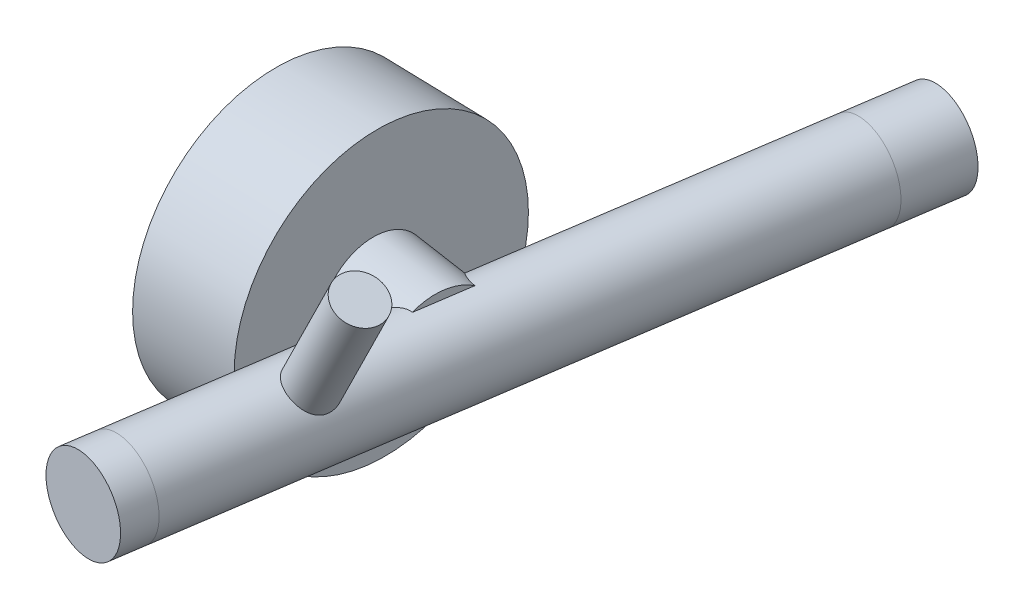
ISO-10303-21;
HEADER;
FILE_DESCRIPTION(('STEP AP214'),'2;1');
FILE_NAME('part.step','',(''),(''),'','','');
FILE_SCHEMA(('AUTOMOTIVE_DESIGN { 1 0 10303 214 1 1 1 1 }'));
ENDSEC;
DATA;
#1=APPLICATION_CONTEXT('core data for automotive mechanical design processes');
#2=APPLICATION_PROTOCOL_DEFINITION('international standard','automotive_design',2000,#1);
#3=PRODUCT_CONTEXT('',#1,'mechanical');
#4=PRODUCT('Part','Part','',(#3));
#5=PRODUCT_RELATED_PRODUCT_CATEGORY('part','',(#4));
#6=PRODUCT_DEFINITION_FORMATION('','',#4);
#7=PRODUCT_DEFINITION_CONTEXT('part definition',#1,'design');
#8=PRODUCT_DEFINITION('design','',#6,#7);
#9=PRODUCT_DEFINITION_SHAPE('','',#8);
#10=(LENGTH_UNIT() NAMED_UNIT(*) SI_UNIT(.MILLI.,.METRE.));
#11=(NAMED_UNIT(*) PLANE_ANGLE_UNIT() SI_UNIT($,.RADIAN.));
#12=(NAMED_UNIT(*) SI_UNIT($,.STERADIAN.) SOLID_ANGLE_UNIT());
#13=UNCERTAINTY_MEASURE_WITH_UNIT(LENGTH_MEASURE(1.E-05),#10,'distance_accuracy_value','');
#14=(GEOMETRIC_REPRESENTATION_CONTEXT(3) GLOBAL_UNCERTAINTY_ASSIGNED_CONTEXT((#13)) GLOBAL_UNIT_ASSIGNED_CONTEXT((#10,
#11,#12)) REPRESENTATION_CONTEXT('',''));
#15=CARTESIAN_POINT('',(0.,0.,0.));
#16=DIRECTION('',(0.,0.,1.));
#17=DIRECTION('',(1.,0.,0.));
#18=AXIS2_PLACEMENT_3D('',#15,#16,#17);
#19=CARTESIAN_POINT('',(-542.552954,1419.6,-162.373292));
#20=DIRECTION('',(-0.989015863441509,0.,-0.14780941059705));
#21=DIRECTION('',(-0.14780941059705,0.,0.989015863441509));
#22=AXIS2_PLACEMENT_3D('',#19,#20,#21);
#23=CYLINDRICAL_SURFACE('',#22,20.);
#24=CARTESIAN_POINT('',(-542.552954,1419.6,-162.373292));
#25=DIRECTION('',(-0.989015863441509,0.,-0.147809410597049));
#26=DIRECTION('',(-0.147809410597049,0.,0.989015863441509));
#27=AXIS2_PLACEMENT_3D('',#24,#25,#26);
#28=CIRCLE('',#27,20.);
#29=CARTESIAN_POINT('',(-544.110222763976,1436.6,-151.953363305583));
#30=VERTEX_POINT('',#29);
#31=CARTESIAN_POINT('',(-540.995685228536,1436.6,-172.793220693298));
#32=VERTEX_POINT('',#31);
#33=EDGE_CURVE('E115',#30,#32,#28,.T.);
#34=ORIENTED_EDGE('',*,*,#33,.T.);
#35=CARTESIAN_POINT('',(-540.995685236024,1436.6,-172.793220694417));
#36=CARTESIAN_POINT('',(-541.140799717402,1436.6000027427,-172.81489763645));
#37=CARTESIAN_POINT('',(-541.285433603555,1436.59809986526,-172.839624569867));
#38=CARTESIAN_POINT('',(-541.573434028901,1436.59051320884,-172.895031583175));
#39=CARTESIAN_POINT('',(-541.716800760971,1436.58483001569,-172.925710740151));
#40=CARTESIAN_POINT('',(-542.143956030332,1436.56218914441,-173.026314235167));
#41=CARTESIAN_POINT('',(-542.42546599188,1436.53963987295,-173.104905119131));
#42=CARTESIAN_POINT('',(-542.975876270462,1436.48068809962,-173.281539593919));
#43=CARTESIAN_POINT('',(-543.244904071715,1436.44450450193,-173.379264648698));
#44=CARTESIAN_POINT('',(-543.77394754055,1436.35905174085,-173.592140279418));
#45=CARTESIAN_POINT('',(-544.03395779421,1436.30977486523,-173.707301108175));
#46=CARTESIAN_POINT('',(-544.651192937682,1436.1758069705,-174.003258611011));
#47=CARTESIAN_POINT('',(-545.003572632827,1436.08492514702,-174.191356724659));
#48=CARTESIAN_POINT('',(-545.689353890084,1435.88075194828,-174.588663111797));
#49=CARTESIAN_POINT('',(-546.022747178634,1435.76745089836,-174.797880479816));
#50=CARTESIAN_POINT('',(-546.674552284306,1435.51907347671,-175.232704421948));
#51=CARTESIAN_POINT('',(-546.992813698709,1435.38382118947,-175.45843454881));
#52=CARTESIAN_POINT('',(-547.61278840835,1435.09341961031,-175.919413693505));
#53=CARTESIAN_POINT('',(-547.914502259248,1434.93827098707,-176.154662391247));
#54=CARTESIAN_POINT('',(-548.648105291446,1434.52742012704,-176.748058236567));
#55=CARTESIAN_POINT('',(-549.070717932135,1434.25989184851,-177.109537995157));
#56=CARTESIAN_POINT('',(-549.885414223956,1433.68312590637,-177.833886267784));
#57=CARTESIAN_POINT('',(-550.277483600929,1433.37386892343,-178.196755348981));
#58=CARTESIAN_POINT('',(-551.031346411772,1432.71471164914,-178.914528590849));
#59=CARTESIAN_POINT('',(-551.393208933736,1432.36490873265,-179.269449488214));
#60=CARTESIAN_POINT('',(-552.087275567161,1431.62403218624,-179.964694122371));
#61=CARTESIAN_POINT('',(-552.419491635391,1431.23297533466,-180.305023714975));
#62=CARTESIAN_POINT('',(-552.983262593467,1430.49970621035,-180.891812024833));
#63=CARTESIAN_POINT('',(-553.220926412971,1430.16555914915,-181.142502896956));
#64=CARTESIAN_POINT('',(-553.675844065069,1429.47213723682,-181.627224853981));
#65=CARTESIAN_POINT('',(-553.893098586732,1429.11286323475,-181.861256501274));
#66=CARTESIAN_POINT('',(-554.305190605022,1428.37010413023,-182.308774281713));
#67=CARTESIAN_POINT('',(-554.500052272652,1427.98664583854,-182.522282526453));
#68=CARTESIAN_POINT('',(-554.865480934127,1427.19621026646,-182.925250153307));
#69=CARTESIAN_POINT('',(-555.036052536744,1426.78923746834,-183.114714096816));
#70=CARTESIAN_POINT('',(-555.322437223528,1426.02818491063,-183.434401173977));
#71=CARTESIAN_POINT('',(-555.44258943374,1425.67763794469,-183.569161395526));
#72=CARTESIAN_POINT('',(-555.663524563173,1424.96329846946,-183.817770332757));
#73=CARTESIAN_POINT('',(-555.764311274815,1424.59950857021,-183.931623142626));
#74=CARTESIAN_POINT('',(-555.945164577548,1423.86063728769,-184.136428904689));
#75=CARTESIAN_POINT('',(-556.025239250538,1423.48556037262,-184.227390788613));
#76=CARTESIAN_POINT('',(-556.163522525511,1422.72629300462,-184.384747748264));
#77=CARTESIAN_POINT('',(-556.221730880333,1422.34210244873,-184.451142546305));
#78=CARTESIAN_POINT('',(-556.315538380175,1421.56555013415,-184.55825269903));
#79=CARTESIAN_POINT('',(-556.351030593499,1421.17315857943,-184.598846594995));
#80=CARTESIAN_POINT('',(-556.398341764731,1420.38508135375,-184.652976496145));
#81=CARTESIAN_POINT('',(-556.410160671915,1419.98939567573,-184.666512443352));
#82=CARTESIAN_POINT('',(-556.409908549607,1419.19806862012,-184.666223812691));
#83=CARTESIAN_POINT('',(-556.397839001597,1418.80242724129,-184.652400931528));
#84=CARTESIAN_POINT('',(-556.350033398823,1418.01447944453,-184.597706030679));
#85=CARTESIAN_POINT('',(-556.314298314347,1417.62217289053,-184.556835119964));
#86=CARTESIAN_POINT('',(-556.223310150456,1416.87289526612,-184.452947351115));
#87=CARTESIAN_POINT('',(-556.169701270584,1416.51546148257,-184.391797856046));
#88=CARTESIAN_POINT('',(-556.043519001952,1415.80834944679,-184.248176172043));
#89=CARTESIAN_POINT('',(-555.970946765983,1415.45867072453,-184.165705279249));
#90=CARTESIAN_POINT('',(-555.807781890001,1414.7689398642,-183.980799383681));
#91=CARTESIAN_POINT('',(-555.7171883563,1414.42888820449,-183.878363390828));
#92=CARTESIAN_POINT('',(-555.519040660957,1413.75996600363,-183.655083997582));
#93=CARTESIAN_POINT('',(-555.411485442213,1413.43109616091,-183.534239449928));
#94=CARTESIAN_POINT('',(-555.171373578034,1412.76021714197,-183.265580061784));
#95=CARTESIAN_POINT('',(-555.037511996609,1412.41922766413,-183.116387701423));
#96=CARTESIAN_POINT('',(-554.752684691415,1411.7528195225,-182.800661170998));
#97=CARTESIAN_POINT('',(-554.601718525511,1411.42740126151,-182.634126552664));
#98=CARTESIAN_POINT('',(-554.283863995787,1410.79271153222,-182.285756508253));
#99=CARTESIAN_POINT('',(-554.116967314961,1410.4834486301,-182.103913095668));
#100=CARTESIAN_POINT('',(-553.768426860045,1409.88167473533,-181.727065104611));
#101=CARTESIAN_POINT('',(-553.586780129569,1409.58916712111,-181.532057889017));
#102=CARTESIAN_POINT('',(-553.116190229106,1408.88031772024,-181.031408999705));
#103=CARTESIAN_POINT('',(-552.818700386523,1408.47448004356,-180.718849761276));
#104=CARTESIAN_POINT('',(-552.19519927087,1407.70105503824,-180.075201736628));
#105=CARTESIAN_POINT('',(-551.869174875182,1407.33348548048,-179.744104450521));
#106=CARTESIAN_POINT('',(-551.189253441463,1406.63590253596,-179.069171004765));
#107=CARTESIAN_POINT('',(-550.835301802184,1406.30596596696,-178.725310622999));
#108=CARTESIAN_POINT('',(-550.100217217311,1405.68448672124,-178.032279246668));
#109=CARTESIAN_POINT('',(-549.719093091591,1405.392931673,-177.68311000399));
#110=CARTESIAN_POINT('',(-549.018761665479,1404.91077601618,-177.066822432202));
#111=CARTESIAN_POINT('',(-548.705349405213,1404.71234265538,-176.799216562056));
#112=CARTESIAN_POINT('',(-548.060138787278,1404.33885448666,-176.269683214557));
#113=CARTESIAN_POINT('',(-547.728338057418,1404.16380270505,-176.007756475929));
#114=CARTESIAN_POINT('',(-547.045414130574,1403.83839982907,-175.495652144994));
#115=CARTESIAN_POINT('',(-546.694335290016,1403.68799496292,-175.245449849424));
#116=CARTESIAN_POINT('',(-545.97022542962,1403.41302481959,-174.763313662659));
#117=CARTESIAN_POINT('',(-545.597208067733,1403.28844367979,-174.53136861131));
#118=CARTESIAN_POINT('',(-544.965401203133,1403.10704028345,-174.173096314311));
#119=CARTESIAN_POINT('',(-544.713556547671,1403.04193151869,-174.038697173453));
#120=CARTESIAN_POINT('',(-544.200011174257,1402.9241295149,-173.784115569016));
#121=CARTESIAN_POINT('',(-543.938314352556,1402.8714314264,-173.663927561609));
#122=CARTESIAN_POINT('',(-543.406216588738,1402.77946313135,-173.44118097017));
#123=CARTESIAN_POINT('',(-543.135847028226,1402.74014942738,-173.338565827751));
#124=CARTESIAN_POINT('',(-542.586748598962,1402.67559058367,-173.153529261868));
#125=CARTESIAN_POINT('',(-542.308025528213,1402.6503359137,-173.071094180197));
#126=CARTESIAN_POINT('',(-541.856442299357,1402.6216642039,-172.957145065278));
#127=CARTESIAN_POINT('',(-541.685661893732,1402.61355530409,-172.918430413791));
#128=CARTESIAN_POINT('',(-541.342046895883,1402.60271647828,-172.849417142083));
#129=CARTESIAN_POINT('',(-541.169210257104,1402.59999245838,-172.81912779391));
#130=CARTESIAN_POINT('',(-540.995685236024,1402.6,-172.793220694417));
#131=B_SPLINE_CURVE_WITH_KNOTS('',3,(#35,#36,#37,#38,#39,#40,#41,#42,#43,#44,#45,#46,#47,#48,
#49,#50,#51,#52,#53,#54,#55,#56,#57,#58,#59,#60,#61,#62,#63,#64,#65,#66,#67,#68,#69,#70,#71,#72,
#73,#74,#75,#76,#77,#78,#79,#80,#81,#82,#83,#84,#85,#86,#87,#88,#89,#90,#91,#92,#93,#94,#95,#96,
#97,#98,#99,#100,#101,#102,#103,#104,#105,#106,#107,#108,#109,#110,#111,#112,#113,#114,#115,
#116,#117,#118,#119,#120,#121,#122,#123,#124,#125,#126,#127,#128,#129,#130),.UNSPECIFIED.,.F.,
.F.,(4,2,2,2,2,2,2,2,2,2,2,2,2,2,2,2,2,2,2,2,2,2,2,2,2,2,2,2,2,2,2,2,2,2,2,2,2,2,2,2,2,2,2,2,2,
2,2,4),(0.,0.440081980607926,0.880095779401678,1.75811038662614,2.62259049388785,
3.48758093288357,4.71450333374393,5.94195635339323,7.17978159933149,8.41756525412041,
10.2664756149553,12.1162449298221,13.9616604664429,15.8063283289607,17.2469130549875,
18.6874491258524,20.1264153691471,21.56510821968,22.7468833824736,23.9284268771906,
25.1095086322015,26.2906037367943,27.4772184950212,28.6638357958308,29.8503795088296,
31.0368745764645,32.1353690064708,33.2337966740178,34.3322788269713,35.4308294677123,
36.6163134073204,37.8018279974562,38.9879649423625,40.1743402169242,41.9489029453851,
43.7242861007542,45.5032307190019,47.2816005184909,48.6529216495624,50.0244201005837,
51.3928853481091,52.7605074871563,53.638243458844,54.5156358840483,55.3901490601416,
56.2640687042674,56.7896992629492,57.3159060098977),.UNSPECIFIED.);
#132=CARTESIAN_POINT('',(-540.995685228536,1402.6,-172.793220693298));
#133=VERTEX_POINT('',#132);
#134=EDGE_CURVE('E88',#32,#133,#131,.T.);
#135=ORIENTED_EDGE('',*,*,#134,.T.);
#136=CARTESIAN_POINT('',(-544.110222763976,1402.6,-151.953363305583));
#137=VERTEX_POINT('',#136);
#138=EDGE_CURVE('E117',#133,#137,#28,.T.);
#139=ORIENTED_EDGE('',*,*,#138,.T.);
#140=CARTESIAN_POINT('',(-544.110222763976,1402.6,-151.953363305583));
#141=CARTESIAN_POINT('',(-544.255334157068,1402.5999972573,-151.975060910947));
#142=CARTESIAN_POINT('',(-544.400877685838,1402.60190013474,-151.993701282605));
#143=CARTESIAN_POINT('',(-544.692493305027,1402.60948679114,-152.024918467252));
#144=CARTESIAN_POINT('',(-544.838565310062,1402.61516998428,-152.037496219221));
#145=CARTESIAN_POINT('',(-545.276469540674,1402.63781085553,-152.066176732284));
#146=CARTESIAN_POINT('',(-545.568656606228,1402.66036012695,-152.07332544323));
#147=CARTESIAN_POINT('',(-546.146659495367,1402.7193119002,-152.065333445798));
#148=CARTESIAN_POINT('',(-546.432504101793,1402.75549549785,-152.050534627734));
#149=CARTESIAN_POINT('',(-547.000669697661,1402.84094825882,-152.001637989972));
#150=CARTESIAN_POINT('',(-547.282988507379,1402.89022513439,-151.967528782581));
#151=CARTESIAN_POINT('',(-547.959783009248,1403.02419302891,-151.8649653056));
#152=CARTESIAN_POINT('',(-548.351759953029,1403.11507485222,-151.788112036831));
#153=CARTESIAN_POINT('',(-549.123736975125,1403.31924805057,-151.608669083974));
#154=CARTESIAN_POINT('',(-549.503731800376,1403.43254910028,-151.506068283788));
#155=CARTESIAN_POINT('',(-550.25418633861,1403.68092652146,-151.280813449367));
#156=CARTESIAN_POINT('',(-550.624538344085,1403.81617880843,-151.157997287551));
#157=CARTESIAN_POINT('',(-551.352200364359,1404.10658038704,-150.898423801418));
#158=CARTESIAN_POINT('',(-551.709510816953,1404.26172900998,-150.761666945665));
#159=CARTESIAN_POINT('',(-552.584551038931,1404.67257986935,-150.408684445139));
#160=CARTESIAN_POINT('',(-553.094383969562,1404.94010814751,-150.186559610606));
#161=CARTESIAN_POINT('',(-554.08526084572,1405.51687408888,-149.732056055383));
#162=CARTESIAN_POINT('',(-554.566291306622,1405.82613107141,-149.499672618955));
#163=CARTESIAN_POINT('',(-555.497070482698,1406.48528834481,-149.033670808377));
#164=CARTESIAN_POINT('',(-555.946890160481,1406.83509126082,-148.800056628253));
#165=CARTESIAN_POINT('',(-556.813899240366,1407.57596780621,-148.338116322045));
#166=CARTESIAN_POINT('',(-557.231101788859,1407.96702465724,-148.109788091841));
#167=CARTESIAN_POINT('',(-557.941798935157,1408.70029378106,-147.713470315435));
#168=CARTESIAN_POINT('',(-558.242372893724,1409.03444084238,-147.543219617593));
#169=CARTESIAN_POINT('',(-558.819131792904,1409.72786275499,-147.21268275303));
#170=CARTESIAN_POINT('',(-559.095317556904,1410.08713675721,-147.052396249955));
#171=CARTESIAN_POINT('',(-559.620244650246,1410.82989586207,-146.74491691292));
#172=CARTESIAN_POINT('',(-559.869015559237,1411.21335415395,-146.597710000453));
#173=CARTESIAN_POINT('',(-560.336293058173,1412.00378972643,-146.31919114209));
#174=CARTESIAN_POINT('',(-560.55480538913,1412.41076252475,-146.187876181583));
#175=CARTESIAN_POINT('',(-560.922143882865,1413.17181508288,-145.965888687535));
#176=CARTESIAN_POINT('',(-561.076446088637,1413.52236204902,-145.872145952931));
#177=CARTESIAN_POINT('',(-561.360413622474,1414.23670152467,-145.698995223656));
#178=CARTESIAN_POINT('',(-561.490083774275,1414.60049142414,-145.619584422493));
#179=CARTESIAN_POINT('',(-561.722914057632,1415.3393627071,-145.476604086059));
#180=CARTESIAN_POINT('',(-561.826084529332,1415.71443962239,-145.413028372249));
#181=CARTESIAN_POINT('',(-562.004332205452,1416.47370699086,-145.302977279747));
#182=CARTESIAN_POINT('',(-562.079409092326,1416.85789754699,-145.256502094345));
#183=CARTESIAN_POINT('',(-562.200433628591,1417.63444986206,-145.181498804199));
#184=CARTESIAN_POINT('',(-562.246243507601,1418.02684141703,-145.153055587205));
#185=CARTESIAN_POINT('',(-562.30731345724,1418.81491864321,-145.115123352875));
#186=CARTESIAN_POINT('',(-562.322573462409,1419.21060432149,-145.105634376154));
#187=CARTESIAN_POINT('',(-562.322247969338,1420.00193137763,-145.105836681518));
#188=CARTESIAN_POINT('',(-562.306664383917,1420.39757275672,-145.11552677418));
#189=CARTESIAN_POINT('',(-562.244956417377,1421.18552055402,-145.153854762458));
#190=CARTESIAN_POINT('',(-562.198833288382,1421.57782710829,-145.182491881243));
#191=CARTESIAN_POINT('',(-562.081447030605,1422.32710473324,-145.255237884263));
#192=CARTESIAN_POINT('',(-562.012302221787,1422.68453851706,-145.298041717735));
#193=CARTESIAN_POINT('',(-561.849642601755,1423.39165055337,-145.398495692495));
#194=CARTESIAN_POINT('',(-561.756129271916,1423.74132927589,-145.45614493132));
#195=CARTESIAN_POINT('',(-561.546032673278,1424.43106013675,-145.585266526096));
#196=CARTESIAN_POINT('',(-561.429448260369,1424.77111179672,-145.656739567573));
#197=CARTESIAN_POINT('',(-561.174678100264,1425.4400339981,-145.812329934249));
#198=CARTESIAN_POINT('',(-561.036491006729,1425.76890384107,-145.89644804751));
#199=CARTESIAN_POINT('',(-560.72832248595,1426.43978286046,-146.083166383648));
#200=CARTESIAN_POINT('',(-560.556690394383,1426.78077233849,-146.18670240897));
#201=CARTESIAN_POINT('',(-560.191999184115,1427.4471804805,-146.405357747496));
#202=CARTESIAN_POINT('',(-559.998939511535,1427.77259874168,-146.520477360117));
#203=CARTESIAN_POINT('',(-559.593120169536,1428.40728847133,-146.760693620464));
#204=CARTESIAN_POINT('',(-559.380350211495,1428.71655137362,-146.885795474069));
#205=CARTESIAN_POINT('',(-558.936859627473,1429.31832526872,-147.144273634045));
#206=CARTESIAN_POINT('',(-558.706135403268,1429.61083288311,-147.277651597946));
#207=CARTESIAN_POINT('',(-558.109732474714,1430.31968228395,-147.618837341348));
#208=CARTESIAN_POINT('',(-557.733858046556,1430.72551996046,-147.830761615648));
#209=CARTESIAN_POINT('',(-556.949416495168,1431.49894496549,-148.263991199703));
#210=CARTESIAN_POINT('',(-556.540834337588,1431.86651452311,-148.485300801259));
#211=CARTESIAN_POINT('',(-555.693290795832,1432.56409746737,-148.931953077792));
#212=CARTESIAN_POINT('',(-555.25427011436,1432.89403403625,-149.157302952634));
#213=CARTESIAN_POINT('',(-554.348682465983,1433.51551328173,-149.605134221745));
#214=CARTESIAN_POINT('',(-553.882124445767,1433.80706832985,-149.827616519359));
#215=CARTESIAN_POINT('',(-553.032209125721,1434.28922398617,-150.212218163117));
#216=CARTESIAN_POINT('',(-552.65425110715,1434.48765734661,-150.376498052843));
#217=CARTESIAN_POINT('',(-551.882412559016,1434.86114551468,-150.694251983649));
#218=CARTESIAN_POINT('',(-551.488529976898,1435.036197296,-150.847724624723));
#219=CARTESIAN_POINT('',(-550.685721763402,1435.36160017145,-151.137784799758));
#220=CARTESIAN_POINT('',(-550.276831327748,1435.51200503737,-151.274408926131));
#221=CARTESIAN_POINT('',(-549.443398647524,1435.78697518031,-151.523768820885));
#222=CARTESIAN_POINT('',(-549.018866201203,1435.91155631994,-151.636519254971));
#223=CARTESIAN_POINT('',(-548.309917610756,1436.09295971616,-151.794414307194));
#224=CARTESIAN_POINT('',(-548.02978286332,1436.15806848094,-151.849308593889));
#225=CARTESIAN_POINT('',(-547.464244523164,1436.27587048474,-151.942620057405));
#226=CARTESIAN_POINT('',(-547.178843035589,1436.32856857325,-151.981043674969));
#227=CARTESIAN_POINT('',(-546.604870613224,1436.42053686834,-152.03848697017));
#228=CARTESIAN_POINT('',(-546.316313152741,1436.45985057233,-152.057569909956));
#229=CARTESIAN_POINT('',(-545.737108257555,1436.52440941609,-152.07398041487));
#230=CARTESIAN_POINT('',(-545.446462374236,1436.54966408608,-152.071322736579));
#231=CARTESIAN_POINT('',(-544.981295687498,1436.57833579599,-152.048262659284));
#232=CARTESIAN_POINT('',(-544.80665850425,1436.58644469584,-152.035354306491));
#233=CARTESIAN_POINT('',(-544.457880318742,1436.59728352171,-152.000888724093));
#234=CARTESIAN_POINT('',(-544.283740070236,1436.60000754162,-151.979322029231));
#235=CARTESIAN_POINT('',(-544.110222763976,1436.6,-151.953363305583));
#236=B_SPLINE_CURVE_WITH_KNOTS('',3,(#140,#141,#142,#143,#144,#145,#146,#147,#148,#149,#150,
#151,#152,#153,#154,#155,#156,#157,#158,#159,#160,#161,#162,#163,#164,#165,#166,#167,#168,#169,
#170,#171,#172,#173,#174,#175,#176,#177,#178,#179,#180,#181,#182,#183,#184,#185,#186,#187,#188,
#189,#190,#191,#192,#193,#194,#195,#196,#197,#198,#199,#200,#201,#202,#203,#204,#205,#206,#207,
#208,#209,#210,#211,#212,#213,#214,#215,#216,#217,#218,#219,#220,#221,#222,#223,#224,#225,#226,
#227,#228,#229,#230,#231,#232,#233,#234,#235),.UNSPECIFIED.,.F.,.F.,(4,2,2,2,2,2,2,2,2,2,2,2,2,
2,2,2,2,2,2,2,2,2,2,2,2,2,2,2,2,2,2,2,2,2,2,2,2,2,2,2,2,2,2,2,2,2,2,4),(0.,0.440081980221863,
0.880095778630183,1.75811038509224,2.62259049160744,3.48758092985339,4.71450332865346,
5.94195634624074,7.17978159008018,8.41756524277089,10.2664756015107,12.1162449142823,
13.9616604488472,15.8063283093133,17.2469130362691,18.6874491080636,20.1264153522833,
21.5651082037415,22.7468833673204,23.9284268628228,25.1095086186199,26.2906037239995,
27.4772184830117,28.6638357846067,29.8503794983903,31.03687456681,32.1353689975889,
33.2337966659083,34.3322788196332,35.4308294611452,36.6163134013437,37.8018279920691,
38.9879649375685,40.1743402127226,41.9489029403789,43.7242860949417,45.5032307123635,
47.2816005110255,48.6529216395019,50.0244200879254,51.3928853328607,52.7605074693228,
53.6382434404235,54.5156358650412,55.3901490405579,56.2640686841088,56.7896992441561,
57.3159059924721),.UNSPECIFIED.);
#237=EDGE_CURVE('E107',#137,#30,#236,.T.);
#238=ORIENTED_EDGE('',*,*,#237,.T.);
#239=EDGE_LOOP('',(#34,#135,#139,#238));
#240=FACE_BOUND('',#239,.T.);
#241=CARTESIAN_POINT('',(-573.655585503097,1419.6,-167.021611405609));
#242=DIRECTION('',(-0.999657324931295,0.,-0.0261769499982011));
#243=DIRECTION('',(0.0261769499982011,0.,-0.999657324931295));
#244=AXIS2_PLACEMENT_3D('',#241,#242,#243);
#245=ELLIPSE('',#244,20.1501965036612,20.);
#246=CARTESIAN_POINT('',(-573.128114816766,1419.6,-187.164902939298));
#247=VERTEX_POINT('',#246);
#248=EDGE_CURVE('E83',#247,#247,#245,.F.);
#249=ORIENTED_EDGE('',*,*,#248,.T.);
#250=EDGE_LOOP('',(#249));
#251=FACE_BOUND('',#250,.T.);
#252=ADVANCED_FACE('F79',(#240,#251),#23,.T.);
#253=CARTESIAN_POINT('',(-517.770606,1419.6,-328.195852));
#254=DIRECTION('',(0.147809419708946,0.,-0.989015862079727));
#255=DIRECTION('',(-0.989015862079727,0.,-0.147809419708946));
#256=AXIS2_PLACEMENT_3D('',#253,#254,#255);
#257=PLANE('',#256);
#258=CARTESIAN_POINT('',(-517.770606,1419.6,-328.195852));
#259=DIRECTION('',(0.147809419708946,0.,-0.989015862079727));
#260=DIRECTION('',(-0.989015862079727,0.,-0.147809419708946));
#261=AXIS2_PLACEMENT_3D('',#258,#259,#260);
#262=CIRCLE('',#261,17.);
#263=CARTESIAN_POINT('',(-534.583875655355,1419.6,-330.708612135052));
#264=VERTEX_POINT('',#263);
#265=EDGE_CURVE('E118',#264,#264,#262,.T.);
#266=ORIENTED_EDGE('',*,*,#265,.T.);
#267=EDGE_LOOP('',(#266));
#268=FACE_BOUND('',#267,.T.);
#269=ADVANCED_FACE('F81',(#268),#257,.T.);
#270=CARTESIAN_POINT('',(-521.613651,1419.6,-302.481439));
#271=DIRECTION('',(0.147809419708946,0.,-0.989015862079727));
#272=DIRECTION('',(-0.989015862079727,0.,-0.147809419708946));
#273=AXIS2_PLACEMENT_3D('',#270,#271,#272);
#274=CYLINDRICAL_SURFACE('',#273,17.);
#275=ORIENTED_EDGE('',*,*,#265,.F.);
#276=EDGE_LOOP('',(#275));
#277=FACE_BOUND('',#276,.T.);
#278=CARTESIAN_POINT('',(-521.613651434475,1419.6,-302.481439064933));
#279=DIRECTION('',(0.147809419708946,0.,-0.989015862079727));
#280=DIRECTION('',(-0.989015862079727,0.,-0.147809419708946));
#281=AXIS2_PLACEMENT_3D('',#278,#279,#280);
#282=CIRCLE('',#281,17.0000000000001);
#283=CARTESIAN_POINT('',(-538.426921089831,1419.6,-304.994199199985));
#284=VERTEX_POINT('',#283);
#285=EDGE_CURVE('E132',#284,#284,#282,.T.);
#286=ORIENTED_EDGE('',*,*,#285,.T.);
#287=EDGE_LOOP('',(#286));
#288=FACE_BOUND('',#287,.T.);
#289=ADVANCED_FACE('F153',(#277,#288),#274,.T.);
#290=CARTESIAN_POINT('',(-558.6,1419.6,-55.));
#291=DIRECTION('',(0.147809409886339,0.,-0.989015863547725));
#292=DIRECTION('',(-0.989015863547725,0.,-0.147809409886339));
#293=AXIS2_PLACEMENT_3D('',#290,#291,#292);
#294=CYLINDRICAL_SURFACE('',#293,17.0000000000001);
#295=CARTESIAN_POINT('',(-551.093058189755,1436.57165335643,-111.869188396827));
#296=CARTESIAN_POINT('',(-551.091903565267,1436.57381364335,-111.62423998645));
#297=CARTESIAN_POINT('',(-551.079181504332,1436.57652013393,-111.379321171468));
#298=CARTESIAN_POINT('',(-551.031343575187,1436.58239430512,-110.891588432794));
#299=CARTESIAN_POINT('',(-550.996214561069,1436.58556225561,-110.648775829612));
#300=CARTESIAN_POINT('',(-550.904566853397,1436.591510953,-110.166681244256));
#301=CARTESIAN_POINT('',(-550.848002130336,1436.59429084892,-109.927408019298));
#302=CARTESIAN_POINT('',(-550.714818525198,1436.59845609358,-109.4544548886));
#303=CARTESIAN_POINT('',(-550.638190344272,1436.59984079425,-109.220777631389));
#304=CARTESIAN_POINT('',(-550.381544769377,1436.60027759939,-108.53352971869));
#305=CARTESIAN_POINT('',(-550.174015282011,1436.59569078573,-108.089980964553));
#306=CARTESIAN_POINT('',(-549.696279310266,1436.56800727711,-107.239015407316));
#307=CARTESIAN_POINT('',(-549.426082522395,1436.54491344439,-106.831593027851));
#308=CARTESIAN_POINT('',(-548.966978041143,1436.48840449762,-106.23434869844));
#309=CARTESIAN_POINT('',(-548.796390468757,1436.46434604014,-106.02928049249));
#310=CARTESIAN_POINT('',(-548.440783233712,1436.40687615461,-105.633319821777));
#311=CARTESIAN_POINT('',(-548.255761159289,1436.37346316115,-105.442429736386));
#312=CARTESIAN_POINT('',(-547.872848762992,1436.2960991065,-105.076192522064));
#313=CARTESIAN_POINT('',(-547.674954066601,1436.25214444914,-104.900850725265));
#314=CARTESIAN_POINT('',(-547.268086658243,1436.15269818624,-104.567286936142));
#315=CARTESIAN_POINT('',(-547.059119357271,1436.09721217784,-104.409056694579));
#316=CARTESIAN_POINT('',(-546.633171723543,1435.97425724878,-104.112081844544));
#317=CARTESIAN_POINT('',(-546.416251037618,1435.90686705877,-103.973219329288));
#318=CARTESIAN_POINT('',(-545.975075393924,1435.75931209358,-103.715287488097));
#319=CARTESIAN_POINT('',(-545.750820361147,1435.67914718773,-103.59621836466));
#320=CARTESIAN_POINT('',(-545.297295666776,1435.50588882078,-103.379403918994));
#321=CARTESIAN_POINT('',(-545.068030397971,1435.41280633018,-103.281640681557));
#322=CARTESIAN_POINT('',(-544.606605882323,1435.21381948786,-103.108589574378));
#323=CARTESIAN_POINT('',(-544.374447014359,1435.10791679928,-103.033298793704));
#324=CARTESIAN_POINT('',(-543.935345659552,1434.8962674459,-102.913211071024));
#325=CARTESIAN_POINT('',(-543.728453821259,1434.7917987238,-102.865962637669));
#326=CARTESIAN_POINT('',(-543.315955089675,1434.57386247416,-102.790481339391));
#327=CARTESIAN_POINT('',(-543.110348092234,1434.46039568647,-102.762246912849));
#328=CARTESIAN_POINT('',(-542.702073626771,1434.22540417849,-102.725004493409));
#329=CARTESIAN_POINT('',(-542.499405647921,1434.10388087944,-102.715993118613));
#330=CARTESIAN_POINT('',(-542.098464456958,1433.85388307722,-102.717134402881));
#331=CARTESIAN_POINT('',(-541.900191229101,1433.72540859895,-102.727286993284));
#332=CARTESIAN_POINT('',(-541.518970553319,1433.46925264989,-102.765496074121));
#333=CARTESIAN_POINT('',(-541.335748786302,1433.34184247587,-102.792648198727));
#334=CARTESIAN_POINT('',(-540.975354848192,1433.08304180055,-102.86359750666));
#335=CARTESIAN_POINT('',(-540.798184774396,1432.95164994853,-102.907400398016));
#336=CARTESIAN_POINT('',(-540.450772515199,1432.68619961413,-103.011087548394));
#337=CARTESIAN_POINT('',(-540.28052856395,1432.5521418246,-103.070967678486));
#338=CARTESIAN_POINT('',(-539.947438670942,1432.28253009162,-103.206206923746));
#339=CARTESIAN_POINT('',(-539.784595636409,1432.14697558579,-103.281572058636));
#340=CARTESIAN_POINT('',(-539.456051587786,1431.86650524521,-103.452688791489));
#341=CARTESIAN_POINT('',(-539.290900510969,1431.72157556048,-103.549473572075));
#342=CARTESIAN_POINT('',(-538.969860447167,1431.43296954137,-103.759103940655));
#343=CARTESIAN_POINT('',(-538.813974666274,1431.28929365534,-103.871955042779));
#344=CARTESIAN_POINT('',(-538.511641626941,1431.00469591358,-104.112934625357));
#345=CARTESIAN_POINT('',(-538.365198275699,1430.86377521451,-104.241069368341));
#346=CARTESIAN_POINT('',(-538.081890999047,1430.58626474881,-104.511811382801));
#347=CARTESIAN_POINT('',(-537.945027730484,1430.44967527949,-104.654419644994));
#348=CARTESIAN_POINT('',(-537.666519495855,1430.16783007756,-104.969649447326));
#349=CARTESIAN_POINT('',(-537.525973991433,1430.02324798793,-105.143848331633));
#350=CARTESIAN_POINT('',(-537.256695238076,1429.74354210634,-105.50812189446));
#351=CARTESIAN_POINT('',(-537.127958417376,1429.60841545736,-105.698191739052));
#352=CARTESIAN_POINT('',(-536.882156002692,1429.34977723098,-106.093395568098));
#353=CARTESIAN_POINT('',(-536.765096302014,1429.22627152028,-106.298537069257));
#354=CARTESIAN_POINT('',(-536.542736507188,1428.99332297331,-106.722773619164));
#355=CARTESIAN_POINT('',(-536.437437783447,1428.88388177563,-106.941870289327));
#356=CARTESIAN_POINT('',(-536.238111667931,1428.68090217842,-107.394160997876));
#357=CARTESIAN_POINT('',(-536.144158313038,1428.58746672991,-107.627434114613));
#358=CARTESIAN_POINT('',(-535.968566985357,1428.41984969986,-108.105133335521));
#359=CARTESIAN_POINT('',(-535.886922006273,1428.34565714723,-108.349552990746));
#360=CARTESIAN_POINT('',(-535.736319836531,1428.21879008934,-108.847383017228));
#361=CARTESIAN_POINT('',(-535.667346685507,1428.16608841248,-109.10078159256));
#362=CARTESIAN_POINT('',(-535.542395880834,1428.08387458026,-109.614442798663));
#363=CARTESIAN_POINT('',(-535.486415708089,1428.05435792711,-109.874704087967));
#364=CARTESIAN_POINT('',(-535.394762476408,1428.02199563926,-110.362821132742));
#365=CARTESIAN_POINT('',(-535.357347743538,1428.01601077182,-110.590147871438));
#366=CARTESIAN_POINT('',(-535.292769029166,1428.02216740745,-111.045994846708));
#367=CARTESIAN_POINT('',(-535.26560401531,1428.03430708439,-111.274514960733));
#368=CARTESIAN_POINT('',(-535.221777252474,1428.0763755876,-111.73094363378));
#369=CARTESIAN_POINT('',(-535.205116972,1428.10630689991,-111.958852102865));
#370=CARTESIAN_POINT('',(-535.182523122953,1428.18315392843,-112.412314086409));
#371=CARTESIAN_POINT('',(-535.176589723206,1428.23006991194,-112.637867563749));
#372=CARTESIAN_POINT('',(-535.175660554863,1428.3366872048,-113.072754118915));
#373=CARTESIAN_POINT('',(-535.180079102985,1428.39553979995,-113.28229528781));
#374=CARTESIAN_POINT('',(-535.19878881583,1428.52617233692,-113.696888822209));
#375=CARTESIAN_POINT('',(-535.213083278172,1428.59795659077,-113.901939664768));
#376=CARTESIAN_POINT('',(-535.270977355308,1428.83074276938,-114.50885680672));
#377=CARTESIAN_POINT('',(-535.329586772506,1429.00924378069,-114.902745536031));
#378=CARTESIAN_POINT('',(-535.497657704577,1429.42609467783,-115.709698868348));
#379=CARTESIAN_POINT('',(-535.61244531615,1429.66908685453,-116.119251887707));
#380=CARTESIAN_POINT('',(-535.824738012698,1430.05653443848,-116.703377502538));
#381=CARTESIAN_POINT('',(-535.902254375237,1430.18960929075,-116.893171766986));
#382=CARTESIAN_POINT('',(-536.070974217584,1430.46186023957,-117.262118121408));
#383=CARTESIAN_POINT('',(-536.162179814965,1430.60103727769,-117.441268558905));
#384=CARTESIAN_POINT('',(-536.369468941284,1430.89965115576,-117.807532078429));
#385=CARTESIAN_POINT('',(-536.487194494049,1431.05961179944,-117.99329131333));
#386=CARTESIAN_POINT('',(-536.739977394625,1431.38274224282,-118.349464572111));
#387=CARTESIAN_POINT('',(-536.875028284896,1431.54591082777,-118.519884273309));
#388=CARTESIAN_POINT('',(-537.162551519991,1431.87332552039,-118.844235337875));
#389=CARTESIAN_POINT('',(-537.315024126801,1432.03757164424,-118.998166453221));
#390=CARTESIAN_POINT('',(-537.637189731345,1432.36491922336,-119.288205335385));
#391=CARTESIAN_POINT('',(-537.806881277795,1432.52802077385,-119.424314602092));
#392=CARTESIAN_POINT('',(-538.155365507962,1432.84397603024,-119.671949191868));
#393=CARTESIAN_POINT('',(-538.333461010702,1432.99697006769,-119.784275623972));
#394=CARTESIAN_POINT('',(-538.704157322455,1433.29795917263,-119.990173558281));
#395=CARTESIAN_POINT('',(-538.896757885892,1433.44595432469,-120.083745377908));
#396=CARTESIAN_POINT('',(-539.295118540528,1433.73497912537,-120.250996025148));
#397=CARTESIAN_POINT('',(-539.500868286425,1433.87601409887,-120.324690259096));
#398=CARTESIAN_POINT('',(-539.924077949446,1434.14953373181,-120.451397012073));
#399=CARTESIAN_POINT('',(-540.141536594135,1434.28201931689,-120.504411773252));
#400=CARTESIAN_POINT('',(-540.561776003491,1434.52296070345,-120.584500131429));
#401=CARTESIAN_POINT('',(-540.763543198946,1434.6324571851,-120.613784436068));
#402=CARTESIAN_POINT('',(-541.173280812297,1434.84269950327,-120.655280441683));
#403=CARTESIAN_POINT('',(-541.381250698829,1434.9434460865,-120.667493600826));
#404=CARTESIAN_POINT('',(-541.801738493761,1435.1355881772,-120.6748369204));
#405=CARTESIAN_POINT('',(-542.014256167479,1435.2269841658,-120.66996796023));
#406=CARTESIAN_POINT('',(-542.44215851007,1435.40007697071,-120.643331997232));
#407=CARTESIAN_POINT('',(-542.657543231706,1435.48177360824,-120.621564682989));
#408=CARTESIAN_POINT('',(-543.084685891677,1435.63364008804,-120.562147880519));
#409=CARTESIAN_POINT('',(-543.296418109367,1435.70402567487,-120.524861945562));
#410=CARTESIAN_POINT('',(-543.719560727538,1435.83552830299,-120.434892208601));
#411=CARTESIAN_POINT('',(-543.930970990029,1435.89664210325,-120.382203041035));
#412=CARTESIAN_POINT('',(-544.351914545733,1436.00983387722,-120.261956055752));
#413=CARTESIAN_POINT('',(-544.561448197933,1436.06191361569,-120.19440114786));
#414=CARTESIAN_POINT('',(-544.977399708513,1436.15749175767,-120.044943750158));
#415=CARTESIAN_POINT('',(-545.183816408637,1436.2009870403,-119.963036062772));
#416=CARTESIAN_POINT('',(-545.609794063809,1436.28331348211,-119.777782535137));
#417=CARTESIAN_POINT('',(-545.828958421062,1436.32142164774,-119.673198689362));
#418=CARTESIAN_POINT('',(-546.260555481448,1436.38896238892,-119.448446633852));
#419=CARTESIAN_POINT('',(-546.472985096631,1436.41839103473,-119.328271400311));
#420=CARTESIAN_POINT('',(-547.098193328856,1436.49501372252,-118.945111252139));
#421=CARTESIAN_POINT('',(-547.498977497711,1436.53056028701,-118.659454458733));
#422=CARTESIAN_POINT('',(-548.085183833139,1436.56779165406,-118.17418568306));
#423=CARTESIAN_POINT('',(-548.286378141074,1436.57751583754,-117.993677809831));
#424=CARTESIAN_POINT('',(-548.673440408938,1436.59148720573,-117.616507962948));
#425=CARTESIAN_POINT('',(-548.85930520637,1436.59573326293,-117.41984267262));
#426=CARTESIAN_POINT('',(-549.213500866669,1436.60021277446,-117.011149379858));
#427=CARTESIAN_POINT('',(-549.381825785935,1436.60044487297,-116.799116210834));
#428=CARTESIAN_POINT('',(-549.698540371255,1436.5983724215,-116.360796873934));
#429=CARTESIAN_POINT('',(-549.846941418289,1436.59606932664,-116.134518952444));
#430=CARTESIAN_POINT('',(-550.117122964084,1436.59042621675,-115.676433574636));
#431=CARTESIAN_POINT('',(-550.239611103138,1436.58712227984,-115.445043906447));
#432=CARTESIAN_POINT('',(-550.4618101342,1436.58059215101,-114.971503918341));
#433=CARTESIAN_POINT('',(-550.561518704245,1436.57736596706,-114.729352504462));
#434=CARTESIAN_POINT('',(-550.736091064062,1436.57190400184,-114.236987271211));
#435=CARTESIAN_POINT('',(-550.811023541685,1436.56966547658,-113.986797887886));
#436=CARTESIAN_POINT('',(-550.935052718444,1436.56673991719,-113.480217914541));
#437=CARTESIAN_POINT('',(-550.984166524081,1436.56605185478,-113.223831548516));
#438=CARTESIAN_POINT('',(-551.04529785489,1436.56633543485,-112.784069356924));
#439=CARTESIAN_POINT('',(-551.063997541627,1436.56687533519,-112.601593540879));
#440=CARTESIAN_POINT('',(-551.088308749216,1436.56872606516,-112.235802338799));
#441=CARTESIAN_POINT('',(-551.093922213121,1436.57003678031,-112.052487081457));
#442=CARTESIAN_POINT('',(-551.093058189755,1436.57165335643,-111.869188396827));
#443=B_SPLINE_CURVE_WITH_KNOTS('',3,(#295,#296,#297,#298,#299,#300,#301,#302,#303,#304,#305,
#306,#307,#308,#309,#310,#311,#312,#313,#314,#315,#316,#317,#318,#319,#320,#321,#322,#323,#324,
#325,#326,#327,#328,#329,#330,#331,#332,#333,#334,#335,#336,#337,#338,#339,#340,#341,#342,#343,
#344,#345,#346,#347,#348,#349,#350,#351,#352,#353,#354,#355,#356,#357,#358,#359,#360,#361,#362,
#363,#364,#365,#366,#367,#368,#369,#370,#371,#372,#373,#374,#375,#376,#377,#378,#379,#380,#381,
#382,#383,#384,#385,#386,#387,#388,#389,#390,#391,#392,#393,#394,#395,#396,#397,#398,#399,#400,
#401,#402,#403,#404,#405,#406,#407,#408,#409,#410,#411,#412,#413,#414,#415,#416,#417,#418,#419,
#420,#421,#422,#423,#424,#425,#426,#427,#428,#429,#430,#431,#432,#433,#434,#435,#436,#437,#438,
#439,#440,#441,#442),.UNSPECIFIED.,.T.,.F.,(4,2,2,2,2,2,2,2,2,2,2,2,2,2,2,2,2,2,2,2,2,2,2,2,2,2,
2,2,2,2,2,2,2,2,2,2,2,2,2,2,2,2,2,2,2,2,2,2,2,2,2,2,2,2,2,2,2,2,2,2,2,2,2,2,2,2,2,2,2,2,2,2,2,
4),(0.,0.734675994319876,1.46978341176786,2.20647837383969,2.94351537954337,4.40621915683493,
5.86869676087274,6.67138807442714,7.47421379268251,8.27731377588894,9.08002485364435,
9.87761329681062,10.6752098992604,11.4721332268189,12.2689532813895,12.9776532866075,
13.6862950792153,14.3948121906958,15.1033267637519,15.7770229695852,16.4509503329563,
17.1247047847085,17.7987216525389,18.5182662688034,19.2380584384011,19.9581465654272,
20.6782840160302,21.4767608864733,22.2749954402672,23.0736308368853,23.8723591948156,
24.6760464595614,25.4792744999128,26.2814838205162,27.0835374775494,27.7740078219439,
28.4644086034787,29.1549058781026,29.8454140200516,30.4978057532822,31.150415428861,
32.4548450011042,33.9182181530634,34.650909846033,35.3837149952635,36.1985578662572,
37.0130979047458,37.8276501938702,38.6421338860545,39.4218679404568,40.2015887967287,
40.9807035741196,41.759733853339,42.4531439879378,43.1464948898714,43.8398100982173,
44.5331380838028,45.2110642626527,45.889226872334,46.567256856127,47.2455328844631,
47.9821511397597,48.7191023959749,50.1927219699323,51.0033956477218,51.8142361523291,
52.6253505326413,53.4359995960484,54.2203397487281,55.0047598150027,55.7869865999218,
56.5686944549284,57.1185455138431,57.6683149252104),.UNSPECIFIED.);
#444=CARTESIAN_POINT('',(-551.093058189755,1436.57165335643,-111.869188396827));
#445=VERTEX_POINT('',#444);
#446=EDGE_CURVE('E12',#445,#445,#443,.T.);
#447=ORIENTED_EDGE('',*,*,#446,.F.);
#448=EDGE_LOOP('',(#447));
#449=FACE_BOUND('',#448,.T.);
#450=ORIENTED_EDGE('',*,*,#134,.F.);
#451=CARTESIAN_POINT('',(-539.596735897859,1436.6,-182.15380926883));
#452=CARTESIAN_POINT('',(-541.271909217959,1436.6,-170.944962816493));
#453=CARTESIAN_POINT('',(-542.947082538059,1436.6,-159.736116364156));
#454=CARTESIAN_POINT('',(-544.917894606153,1436.6,-146.549104851602));
#455=CARTESIAN_POINT('',(-545.213533354147,1436.6,-144.570939791386));
#456=CARTESIAN_POINT('',(-545.509172102141,1436.6,-142.59277473117));
#457=B_SPLINE_CURVE_WITH_KNOTS('',3,(#451,#452,#453,#454,#455,#456),.UNSPECIFIED.,.F.,.F.,(4,2,
4),(0.,34.0000000000001,40.0004044424511),.UNSPECIFIED.);
#458=EDGE_CURVE('E103',#32,#30,#457,.T.);
#459=ORIENTED_EDGE('',*,*,#458,.T.);
#460=ORIENTED_EDGE('',*,*,#237,.F.);
#461=CARTESIAN_POINT('',(-545.509172102141,1402.6,-142.59277473117));
#462=CARTESIAN_POINT('',(-543.833998782041,1402.6,-153.801621183507));
#463=CARTESIAN_POINT('',(-542.158825461941,1402.6,-165.010467635844));
#464=CARTESIAN_POINT('',(-540.188013393847,1402.6,-178.197479148398));
#465=CARTESIAN_POINT('',(-539.892374645853,1402.6,-180.175644208614));
#466=CARTESIAN_POINT('',(-539.596735897859,1402.6,-182.15380926883));
#467=B_SPLINE_CURVE_WITH_KNOTS('',3,(#461,#462,#463,#464,#465,#466),.UNSPECIFIED.,.F.,.F.,(4,2,
4),(0.,34.0000000000001,40.0004044424511),.UNSPECIFIED.);
#468=EDGE_CURVE('E95',#137,#133,#467,.T.);
#469=ORIENTED_EDGE('',*,*,#468,.T.);
#470=EDGE_LOOP('',(#450,#459,#460,#469));
#471=FACE_BOUND('',#470,.T.);
#472=ORIENTED_EDGE('',*,*,#285,.F.);
#473=EDGE_LOOP('',(#472));
#474=FACE_BOUND('',#473,.T.);
#475=CARTESIAN_POINT('',(-558.6,1419.6,-55.));
#476=DIRECTION('',(0.147809409886339,0.,-0.989015863547725));
#477=DIRECTION('',(-0.989015863547725,0.,-0.147809409886339));
#478=AXIS2_PLACEMENT_3D('',#475,#476,#477);
#479=CIRCLE('',#478,17.);
#480=CARTESIAN_POINT('',(-575.413269680311,1419.6,-57.5127599680678));
#481=VERTEX_POINT('',#480);
#482=EDGE_CURVE('E124',#481,#481,#479,.T.);
#483=ORIENTED_EDGE('',*,*,#482,.T.);
#484=EDGE_LOOP('',(#483));
#485=FACE_BOUND('',#484,.T.);
#486=ADVANCED_FACE('F105',(#449,#471,#474,#485),#294,.T.);
#487=CARTESIAN_POINT('',(-560.521522,1419.6,-42.1427938));
#488=DIRECTION('',(0.147809385461221,0.,-0.989015867198083));
#489=DIRECTION('',(-0.989015867198083,0.,-0.147809385461221));
#490=AXIS2_PLACEMENT_3D('',#487,#488,#489);
#491=CYLINDRICAL_SURFACE('',#490,17.);
#492=CARTESIAN_POINT('',(-560.521522,1419.6,-42.1427938));
#493=DIRECTION('',(0.14780938546123,0.,-0.989015867198082));
#494=DIRECTION('',(-0.989015867198082,0.,-0.14780938546123));
#495=AXIS2_PLACEMENT_3D('',#492,#493,#494);
#496=CIRCLE('',#495,17.);
#497=CARTESIAN_POINT('',(-577.334791742367,1419.6,-44.6555533528409));
#498=VERTEX_POINT('',#497);
#499=EDGE_CURVE('E121',#498,#498,#496,.T.);
#500=ORIENTED_EDGE('',*,*,#499,.T.);
#501=EDGE_LOOP('',(#500));
#502=FACE_BOUND('',#501,.T.);
#503=ORIENTED_EDGE('',*,*,#482,.F.);
#504=EDGE_LOOP('',(#503));
#505=FACE_BOUND('',#504,.T.);
#506=ADVANCED_FACE('F217',(#502,#505),#491,.T.);
#507=CARTESIAN_POINT('',(-560.521522,1419.6,-42.1427938));
#508=DIRECTION('',(0.14780938546123,0.,-0.989015867198082));
#509=DIRECTION('',(-0.989015867198082,0.,-0.14780938546123));
#510=AXIS2_PLACEMENT_3D('',#507,#508,#509);
#511=PLANE('',#510);
#512=ORIENTED_EDGE('',*,*,#499,.F.);
#513=EDGE_LOOP('',(#512));
#514=FACE_BOUND('',#513,.T.);
#515=ADVANCED_FACE('F212',(#514),#511,.F.);
#516=CARTESIAN_POINT('',(-542.552954,1419.6,-162.373292));
#517=DIRECTION('',(-0.989015863441509,0.,-0.147809410597049));
#518=DIRECTION('',(-0.147809410597049,0.,0.989015863441509));
#519=AXIS2_PLACEMENT_3D('',#516,#517,#518);
#520=PLANE('',#519);
#521=ORIENTED_EDGE('',*,*,#468,.F.);
#522=ORIENTED_EDGE('',*,*,#138,.F.);
#523=EDGE_LOOP('',(#521,#522));
#524=FACE_BOUND('',#523,.T.);
#525=ADVANCED_FACE('F196',(#524),#520,.F.);
#526=ORIENTED_EDGE('',*,*,#458,.F.);
#527=ORIENTED_EDGE('',*,*,#33,.F.);
#528=EDGE_LOOP('',(#526,#527));
#529=FACE_BOUND('',#528,.T.);
#530=ADVANCED_FACE('F120',(#529),#520,.F.);
#531=CARTESIAN_POINT('',(-520.81,1474.2,-108.53));
#532=DIRECTION('',(0.469666560369013,0.880049081769929,0.0701921345098291));
#533=DIRECTION('',(-0.882225098540645,0.470827861861371,0.));
#534=AXIS2_PLACEMENT_3D('',#531,#532,#533);
#535=PLANE('',#534);
#536=CARTESIAN_POINT('',(-520.81,1474.2,-108.53));
#537=DIRECTION('',(0.469666560369013,0.880049081769929,0.0701921345098291));
#538=DIRECTION('',(-0.882225098540645,0.470827861861371,0.));
#539=AXIS2_PLACEMENT_3D('',#536,#537,#538);
#540=CIRCLE('',#539,8.99999999999994);
#541=CARTESIAN_POINT('',(-528.750025886866,1478.43745075675,-108.53));
#542=VERTEX_POINT('',#541);
#543=EDGE_CURVE('E126',#542,#542,#540,.T.);
#544=ORIENTED_EDGE('',*,*,#543,.T.);
#545=EDGE_LOOP('',(#544));
#546=FACE_BOUND('',#545,.T.);
#547=ADVANCED_FACE('F154',(#546),#535,.T.);
#548=CARTESIAN_POINT('',(-549.94905,1419.6,-112.88486));
#549=DIRECTION('',(0.469666560369013,0.880049081769929,0.0701921345098277));
#550=DIRECTION('',(-0.882225098540645,0.47082786186137,0.));
#551=AXIS2_PLACEMENT_3D('',#548,#549,#550);
#552=CYLINDRICAL_SURFACE('',#551,8.99999999999994);
#553=ORIENTED_EDGE('',*,*,#446,.T.);
#554=EDGE_LOOP('',(#553));
#555=FACE_BOUND('',#554,.T.);
#556=ORIENTED_EDGE('',*,*,#543,.F.);
#557=EDGE_LOOP('',(#556));
#558=FACE_BOUND('',#557,.T.);
#559=ADVANCED_FACE('F171',(#555,#558),#552,.T.);
#560=CARTESIAN_POINT('',(-573.591303,1419.6,-169.476461));
#561=DIRECTION('',(-0.999657324931295,0.,-0.0261769499982011));
#562=DIRECTION('',(-0.0261769499982011,0.,0.999657324931295));
#563=AXIS2_PLACEMENT_3D('',#560,#561,#562);
#564=PLANE('',#563);
#565=ORIENTED_EDGE('',*,*,#248,.F.);
#566=EDGE_LOOP('',(#565));
#567=FACE_BOUND('',#566,.T.);
#568=CARTESIAN_POINT('',(-573.591303,1419.6,-169.476461));
#569=DIRECTION('',(-0.999657324931295,0.,-0.0261769499982011));
#570=DIRECTION('',(-0.0261769499982011,0.,0.999657324931295));
#571=AXIS2_PLACEMENT_3D('',#568,#569,#570);
#572=CIRCLE('',#571,55.);
#573=CARTESIAN_POINT('',(-575.031035249901,1419.6,-114.495308128779));
#574=VERTEX_POINT('',#573);
#575=EDGE_CURVE('E204',#574,#574,#572,.T.);
#576=ORIENTED_EDGE('',*,*,#575,.F.);
#577=EDGE_LOOP('',(#576));
#578=FACE_BOUND('',#577,.T.);
#579=ADVANCED_FACE('F175',(#567,#578),#564,.F.);
#580=CARTESIAN_POINT('',(-613.577596,1419.6,-170.523539));
#581=DIRECTION('',(-0.999657324931295,0.,-0.0261769499982011));
#582=DIRECTION('',(-0.0261769499982011,0.,0.999657324931295));
#583=AXIS2_PLACEMENT_3D('',#580,#581,#582);
#584=PLANE('',#583);
#585=CARTESIAN_POINT('',(-613.577596,1419.6,-170.523539));
#586=DIRECTION('',(-0.999657324931295,0.,-0.0261769499982011));
#587=DIRECTION('',(-0.0261769499982011,0.,0.999657324931295));
#588=AXIS2_PLACEMENT_3D('',#585,#586,#587);
#589=CIRCLE('',#588,55.);
#590=CARTESIAN_POINT('',(-615.017328249901,1419.6,-115.542386128779));
#591=VERTEX_POINT('',#590);
#592=EDGE_CURVE('E201',#591,#591,#589,.T.);
#593=ORIENTED_EDGE('',*,*,#592,.T.);
#594=EDGE_LOOP('',(#593));
#595=FACE_BOUND('',#594,.T.);
#596=ADVANCED_FACE('F179',(#595),#584,.T.);
#597=CARTESIAN_POINT('',(-573.591303,1419.6,-169.476461));
#598=DIRECTION('',(-0.999657324931294,0.,-0.0261769499982011));
#599=DIRECTION('',(-0.0261769499982011,0.,0.999657324931294));
#600=AXIS2_PLACEMENT_3D('',#597,#598,#599);
#601=CYLINDRICAL_SURFACE('',#600,55.);
#602=ORIENTED_EDGE('',*,*,#592,.F.);
#603=EDGE_LOOP('',(#602));
#604=FACE_BOUND('',#603,.T.);
#605=ORIENTED_EDGE('',*,*,#575,.T.);
#606=EDGE_LOOP('',(#605));
#607=FACE_BOUND('',#606,.T.);
#608=ADVANCED_FACE('F183',(#604,#607),#601,.T.);
#609=CLOSED_SHELL('',(#252,#269,#289,#486,#506,#515,#525,#530,#547,#559,#579,#596,#608));
#610=MANIFOLD_SOLID_BREP('B2',#609);
#611=ADVANCED_BREP_SHAPE_REPRESENTATION('',(#18,#610),#14);
#612=SHAPE_DEFINITION_REPRESENTATION(#9,#611);
ENDSEC;
END-ISO-10303-21;
